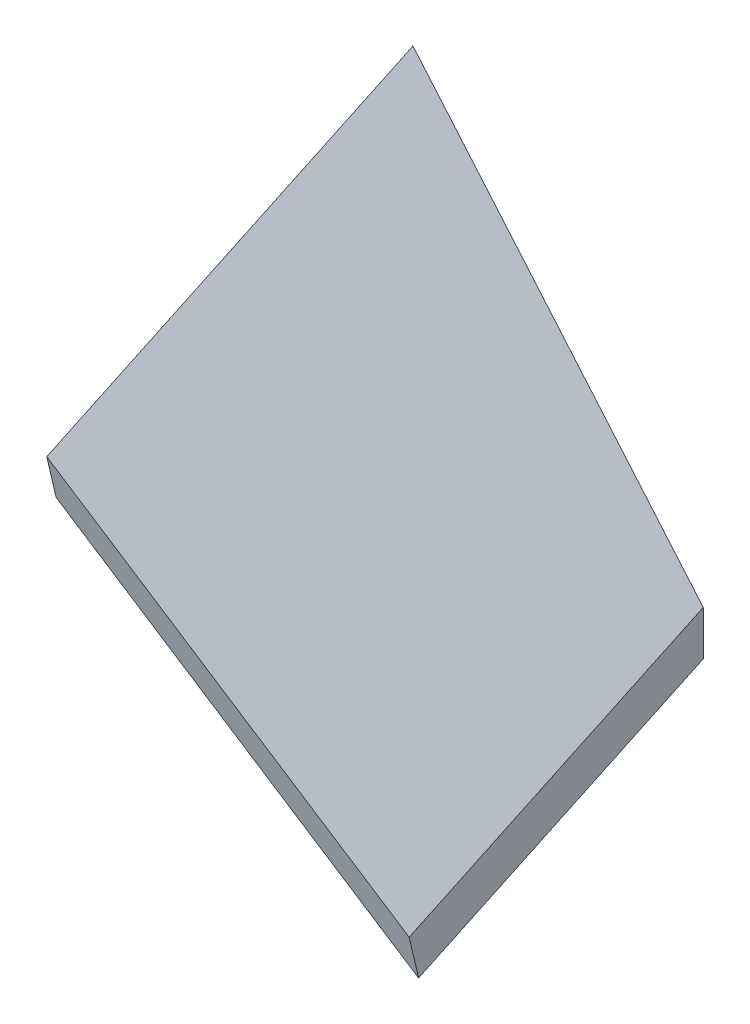
ISO-10303-21;
HEADER;
FILE_DESCRIPTION(('STEP AP214'),'2;1');
FILE_NAME('part.step','',(''),(''),'','','');
FILE_SCHEMA(('AUTOMOTIVE_DESIGN { 1 0 10303 214 1 1 1 1 }'));
ENDSEC;
DATA;
#1=APPLICATION_CONTEXT('core data for automotive mechanical design processes');
#2=APPLICATION_PROTOCOL_DEFINITION('international standard','automotive_design',2000,#1);
#3=PRODUCT_CONTEXT('',#1,'mechanical');
#4=PRODUCT('Part','Part','',(#3));
#5=PRODUCT_RELATED_PRODUCT_CATEGORY('part','',(#4));
#6=PRODUCT_DEFINITION_FORMATION('','',#4);
#7=PRODUCT_DEFINITION_CONTEXT('part definition',#1,'design');
#8=PRODUCT_DEFINITION('design','',#6,#7);
#9=PRODUCT_DEFINITION_SHAPE('','',#8);
#10=(LENGTH_UNIT() NAMED_UNIT(*) SI_UNIT(.MILLI.,.METRE.));
#11=(NAMED_UNIT(*) PLANE_ANGLE_UNIT() SI_UNIT($,.RADIAN.));
#12=(NAMED_UNIT(*) SI_UNIT($,.STERADIAN.) SOLID_ANGLE_UNIT());
#13=UNCERTAINTY_MEASURE_WITH_UNIT(LENGTH_MEASURE(1.E-05),#10,'distance_accuracy_value','');
#14=(GEOMETRIC_REPRESENTATION_CONTEXT(3) GLOBAL_UNCERTAINTY_ASSIGNED_CONTEXT((#13)) GLOBAL_UNIT_ASSIGNED_CONTEXT((#10,
#11,#12)) REPRESENTATION_CONTEXT('',''));
#15=CARTESIAN_POINT('',(0.,0.,0.));
#16=DIRECTION('',(0.,0.,1.));
#17=DIRECTION('',(1.,0.,0.));
#18=AXIS2_PLACEMENT_3D('',#15,#16,#17);
#19=CARTESIAN_POINT('',(-288.754784270996,-476.228476512772,489.281745473094));
#20=DIRECTION('',(-0.728338497084411,-0.619891078335903,-0.291989870824954));
#21=DIRECTION('',(0.648135927567844,-0.761524667621326,0.));
#22=AXIS2_PLACEMENT_3D('',#19,#20,#21);
#23=PLANE('',#22);
#24=DIRECTION('',(0.,0.426127276803473,-0.904663221295116));
#25=VECTOR('',#24,1.);
#26=CARTESIAN_POINT('',(-419.893749999917,-322.147282983398,489.281745473094));
#27=LINE('',#26,#25);
#28=CARTESIAN_POINT('',(-419.893749999917,-176.553789920598,180.188463715056));
#29=VERTEX_POINT('',#28);
#30=CARTESIAN_POINT('',(-419.893749999917,-91.6788690142571,0.));
#31=VERTEX_POINT('',#30);
#32=EDGE_CURVE('E83',#29,#31,#27,.T.);
#33=ORIENTED_EDGE('',*,*,#32,.F.);
#34=DIRECTION('',(-0.677150882640681,0.716337704578485,0.168306194592396));
#35=VECTOR('',#34,1.);
#36=CARTESIAN_POINT('',(-249.626307481099,-356.674634573028,137.868404703144));
#37=LINE('',#36,#35);
#38=CARTESIAN_POINT('',(-603.646875,17.8331556569806,225.860395932909));
#39=VERTEX_POINT('',#38);
#40=EDGE_CURVE('E95',#29,#39,#37,.T.);
#41=ORIENTED_EDGE('',*,*,#40,.T.);
#42=DIRECTION('',(0.,0.426127276803473,-0.904663221295116));
#43=VECTOR('',#42,1.);
#44=CARTESIAN_POINT('',(-603.646875,-106.24729736592,489.281745473094));
#45=LINE('',#44,#43);
#46=CARTESIAN_POINT('',(-603.646874999999,124.221116603221,0.));
#47=VERTEX_POINT('',#46);
#48=EDGE_CURVE('E48',#39,#47,#45,.T.);
#49=ORIENTED_EDGE('',*,*,#48,.T.);
#50=DIRECTION('',(-0.648135927567844,0.761524667621326,0.));
#51=VECTOR('',#50,1.);
#52=CARTESIAN_POINT('',(-288.754784270995,-245.76006254363,0.));
#53=LINE('',#52,#51);
#54=EDGE_CURVE('E93',#31,#47,#53,.T.);
#55=ORIENTED_EDGE('',*,*,#54,.F.);
#56=EDGE_LOOP('',(#33,#41,#49,#55));
#57=FACE_BOUND('',#56,.T.);
#58=ADVANCED_FACE('F44',(#57),#23,.T.);
#59=CARTESIAN_POINT('',(-419.893749999917,-230.468413969141,489.281745473094));
#60=DIRECTION('',(-1.,0.,0.));
#61=DIRECTION('',(0.,-1.,0.));
#62=AXIS2_PLACEMENT_3D('',#59,#60,#61);
#63=PLANE('',#62);
#64=DIRECTION('',(0.,0.973491002005709,0.228725313452446));
#65=VECTOR('',#64,1.);
#66=CARTESIAN_POINT('',(-419.893749999917,-158.824516917964,184.354022016526));
#67=LINE('',#66,#65);
#68=CARTESIAN_POINT('',(-419.893749999917,-151.193164435473,186.147036523108));
#69=VERTEX_POINT('',#68);
#70=EDGE_CURVE('E89',#29,#69,#67,.T.);
#71=ORIENTED_EDGE('',*,*,#70,.F.);
#72=ORIENTED_EDGE('',*,*,#32,.T.);
#73=DIRECTION('',(0.,1.,0.));
#74=VECTOR('',#73,1.);
#75=CARTESIAN_POINT('',(-419.893749999917,5.24382159956268E-13,0.));
#76=LINE('',#75,#74);
#77=CARTESIAN_POINT('',(-419.893749999917,-63.5115522162087,0.));
#78=VERTEX_POINT('',#77);
#79=EDGE_CURVE('E103',#31,#78,#76,.T.);
#80=ORIENTED_EDGE('',*,*,#79,.T.);
#81=DIRECTION('',(0.,0.426127276803473,-0.904663221295116));
#82=VECTOR('',#81,1.);
#83=CARTESIAN_POINT('',(-419.893749999917,-293.97996618535,489.281745473094));
#84=LINE('',#83,#82);
#85=EDGE_CURVE('E113',#69,#78,#84,.T.);
#86=ORIENTED_EDGE('',*,*,#85,.F.);
#87=EDGE_LOOP('',(#71,#72,#80,#86));
#88=FACE_BOUND('',#87,.T.);
#89=ADVANCED_FACE('F117',(#88),#63,.F.);
#90=CARTESIAN_POINT('',(-274.852199557744,-464.395944985108,489.281745473094));
#91=DIRECTION('',(-0.728338497084428,-0.619891078335886,-0.291989870824946));
#92=DIRECTION('',(0.648135927567825,-0.761524667621342,0.));
#93=AXIS2_PLACEMENT_3D('',#90,#91,#92);
#94=PLANE('',#93);
#95=DIRECTION('',(-0.677150882640663,0.716337704578502,0.1683061945924));
#96=VECTOR('',#95,1.);
#97=CARTESIAN_POINT('',(-236.010363388933,-345.717909882691,140.442727715937));
#98=LINE('',#97,#96);
#99=CARTESIAN_POINT('',(-603.646875,43.1937811421148,231.818968740964));
#100=VERTEX_POINT('',#99);
#101=EDGE_CURVE('E53',#69,#100,#98,.T.);
#102=ORIENTED_EDGE('',*,*,#101,.F.);
#103=ORIENTED_EDGE('',*,*,#85,.T.);
#104=DIRECTION('',(-0.648135927567825,0.761524667621342,0.));
#105=VECTOR('',#104,1.);
#106=CARTESIAN_POINT('',(-274.852199557744,-233.927531015967,0.));
#107=LINE('',#106,#105);
#108=CARTESIAN_POINT('',(-603.646875,152.38843340128,0.));
#109=VERTEX_POINT('',#108);
#110=EDGE_CURVE('E114',#78,#109,#107,.T.);
#111=ORIENTED_EDGE('',*,*,#110,.T.);
#112=DIRECTION('',(0.,0.426127276803473,-0.904663221295116));
#113=VECTOR('',#112,1.);
#114=CARTESIAN_POINT('',(-603.646875,-78.0799805678611,489.281745473094));
#115=LINE('',#114,#113);
#116=EDGE_CURVE('E66',#100,#109,#115,.T.);
#117=ORIENTED_EDGE('',*,*,#116,.F.);
#118=EDGE_LOOP('',(#102,#103,#111,#117));
#119=FACE_BOUND('',#118,.T.);
#120=ADVANCED_FACE('F116',(#119),#94,.F.);
#121=CARTESIAN_POINT('',(-603.646874999998,-230.468413969148,489.281745473094));
#122=DIRECTION('',(1.,0.,0.));
#123=DIRECTION('',(0.,1.,0.));
#124=AXIS2_PLACEMENT_3D('',#121,#122,#123);
#125=PLANE('',#124);
#126=DIRECTION('',(0.,-0.973491002005709,-0.228725313452446));
#127=VECTOR('',#126,1.);
#128=CARTESIAN_POINT('',(-603.646874999997,-158.824516917971,184.354022016524));
#129=LINE('',#128,#127);
#130=EDGE_CURVE('E11',#100,#39,#129,.T.);
#131=ORIENTED_EDGE('',*,*,#130,.F.);
#132=ORIENTED_EDGE('',*,*,#116,.T.);
#133=DIRECTION('',(0.,-1.,0.));
#134=VECTOR('',#133,1.);
#135=CARTESIAN_POINT('',(-603.646874999998,-7.1378754054508E-12,0.));
#136=LINE('',#135,#134);
#137=EDGE_CURVE('E97',#109,#47,#136,.T.);
#138=ORIENTED_EDGE('',*,*,#137,.T.);
#139=ORIENTED_EDGE('',*,*,#48,.F.);
#140=EDGE_LOOP('',(#131,#132,#138,#139));
#141=FACE_BOUND('',#140,.T.);
#142=ADVANCED_FACE('F98',(#141),#125,.F.);
#143=CARTESIAN_POINT('',(0.,0.,0.));
#144=DIRECTION('',(0.,0.,1.));
#145=DIRECTION('',(1.,0.,0.));
#146=AXIS2_PLACEMENT_3D('',#143,#144,#145);
#147=PLANE('',#146);
#148=ORIENTED_EDGE('',*,*,#54,.T.);
#149=ORIENTED_EDGE('',*,*,#137,.F.);
#150=ORIENTED_EDGE('',*,*,#110,.F.);
#151=ORIENTED_EDGE('',*,*,#79,.F.);
#152=EDGE_LOOP('',(#148,#149,#150,#151));
#153=FACE_BOUND('',#152,.T.);
#154=ADVANCED_FACE('F102',(#153),#147,.F.);
#155=CARTESIAN_POINT('',(-609.599999999917,189.561431206279,266.208589776236));
#156=DIRECTION('',(0.,-0.228725313452446,0.973491002005709));
#157=DIRECTION('',(-1.,0.,0.));
#158=AXIS2_PLACEMENT_3D('',#155,#156,#157);
#159=PLANE('',#158);
#160=ORIENTED_EDGE('',*,*,#40,.F.);
#161=ORIENTED_EDGE('',*,*,#70,.T.);
#162=ORIENTED_EDGE('',*,*,#101,.T.);
#163=ORIENTED_EDGE('',*,*,#130,.T.);
#164=EDGE_LOOP('',(#160,#161,#162,#163));
#165=FACE_BOUND('',#164,.T.);
#166=ADVANCED_FACE('F46',(#165),#159,.T.);
#167=CLOSED_SHELL('',(#58,#89,#120,#142,#154,#166));
#168=MANIFOLD_SOLID_BREP('B2',#167);
#169=ADVANCED_BREP_SHAPE_REPRESENTATION('',(#18,#168),#14);
#170=SHAPE_DEFINITION_REPRESENTATION(#9,#169);
ENDSEC;
END-ISO-10303-21;
